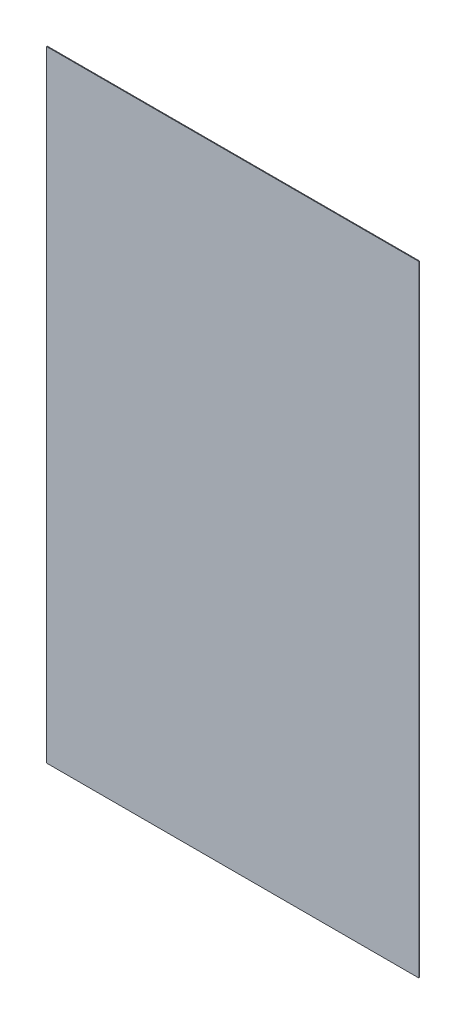
ISO-10303-21;
HEADER;
FILE_DESCRIPTION(('STEP AP214'),'2;1');
FILE_NAME('part.step','',(''),(''),'','','');
FILE_SCHEMA(('AUTOMOTIVE_DESIGN { 1 0 10303 214 1 1 1 1 }'));
ENDSEC;
DATA;
#1=APPLICATION_CONTEXT('core data for automotive mechanical design processes');
#2=APPLICATION_PROTOCOL_DEFINITION('international standard','automotive_design',2000,#1);
#3=PRODUCT_CONTEXT('',#1,'mechanical');
#4=PRODUCT('Part','Part','',(#3));
#5=PRODUCT_RELATED_PRODUCT_CATEGORY('part','',(#4));
#6=PRODUCT_DEFINITION_FORMATION('','',#4);
#7=PRODUCT_DEFINITION_CONTEXT('part definition',#1,'design');
#8=PRODUCT_DEFINITION('design','',#6,#7);
#9=PRODUCT_DEFINITION_SHAPE('','',#8);
#10=(LENGTH_UNIT() NAMED_UNIT(*) SI_UNIT(.MILLI.,.METRE.));
#11=(NAMED_UNIT(*) PLANE_ANGLE_UNIT() SI_UNIT($,.RADIAN.));
#12=(NAMED_UNIT(*) SI_UNIT($,.STERADIAN.) SOLID_ANGLE_UNIT());
#13=UNCERTAINTY_MEASURE_WITH_UNIT(LENGTH_MEASURE(1.E-05),#10,'distance_accuracy_value','');
#14=(GEOMETRIC_REPRESENTATION_CONTEXT(3) GLOBAL_UNCERTAINTY_ASSIGNED_CONTEXT((#13)) GLOBAL_UNIT_ASSIGNED_CONTEXT((#10,
#11,#12)) REPRESENTATION_CONTEXT('',''));
#15=CARTESIAN_POINT('',(0.,0.,0.));
#16=DIRECTION('',(0.,0.,1.));
#17=DIRECTION('',(1.,0.,0.));
#18=AXIS2_PLACEMENT_3D('',#15,#16,#17);
#19=CARTESIAN_POINT('',(0.,0.,3.));
#20=DIRECTION('',(1.,0.,0.));
#21=DIRECTION('',(0.,1.,0.));
#22=AXIS2_PLACEMENT_3D('',#19,#20,#21);
#23=PLANE('',#22);
#24=DIRECTION('',(0.,-1.,0.));
#25=VECTOR('',#24,1.);
#26=CARTESIAN_POINT('',(0.,0.,0.));
#27=LINE('',#26,#25);
#28=CARTESIAN_POINT('',(0.,0.,0.));
#29=VERTEX_POINT('',#28);
#30=CARTESIAN_POINT('',(3.06161699786838E-13,-2500.,0.));
#31=VERTEX_POINT('',#30);
#32=EDGE_CURVE('E98',#29,#31,#27,.T.);
#33=ORIENTED_EDGE('',*,*,#32,.T.);
#34=DIRECTION('',(0.,0.,-1.));
#35=VECTOR('',#34,1.);
#36=CARTESIAN_POINT('',(3.06161699786838E-13,-2500.,3.));
#37=LINE('',#36,#35);
#38=CARTESIAN_POINT('',(3.06161699786838E-13,-2500.,3.));
#39=VERTEX_POINT('',#38);
#40=EDGE_CURVE('E11',#39,#31,#37,.T.);
#41=ORIENTED_EDGE('',*,*,#40,.F.);
#42=DIRECTION('',(0.,-1.,0.));
#43=VECTOR('',#42,1.);
#44=CARTESIAN_POINT('',(0.,0.,3.));
#45=LINE('',#44,#43);
#46=CARTESIAN_POINT('',(0.,0.,3.));
#47=VERTEX_POINT('',#46);
#48=EDGE_CURVE('E86',#47,#39,#45,.T.);
#49=ORIENTED_EDGE('',*,*,#48,.F.);
#50=DIRECTION('',(0.,0.,-1.));
#51=VECTOR('',#50,1.);
#52=CARTESIAN_POINT('',(0.,0.,3.));
#53=LINE('',#52,#51);
#54=EDGE_CURVE('E94',#47,#29,#53,.T.);
#55=ORIENTED_EDGE('',*,*,#54,.T.);
#56=EDGE_LOOP('',(#33,#41,#49,#55));
#57=FACE_BOUND('',#56,.T.);
#58=ADVANCED_FACE('F35',(#57),#23,.F.);
#59=CARTESIAN_POINT('',(3.06161699786838E-13,-2500.,3.));
#60=DIRECTION('',(0.,1.,0.));
#61=DIRECTION('',(0.,0.,1.));
#62=AXIS2_PLACEMENT_3D('',#59,#60,#61);
#63=PLANE('',#62);
#64=DIRECTION('',(1.,0.,0.));
#65=VECTOR('',#64,1.);
#66=CARTESIAN_POINT('',(3.06161699786838E-13,-2500.,0.));
#67=LINE('',#66,#65);
#68=CARTESIAN_POINT('',(1500.,-2500.,0.));
#69=VERTEX_POINT('',#68);
#70=EDGE_CURVE('E90',#31,#69,#67,.T.);
#71=ORIENTED_EDGE('',*,*,#70,.T.);
#72=DIRECTION('',(0.,0.,-1.));
#73=VECTOR('',#72,1.);
#74=CARTESIAN_POINT('',(1500.,-2500.,3.));
#75=LINE('',#74,#73);
#76=CARTESIAN_POINT('',(1500.,-2500.,3.));
#77=VERTEX_POINT('',#76);
#78=EDGE_CURVE('E43',#77,#69,#75,.T.);
#79=ORIENTED_EDGE('',*,*,#78,.F.);
#80=DIRECTION('',(1.,0.,0.));
#81=VECTOR('',#80,1.);
#82=CARTESIAN_POINT('',(3.06161699786838E-13,-2500.,3.));
#83=LINE('',#82,#81);
#84=EDGE_CURVE('E81',#39,#77,#83,.T.);
#85=ORIENTED_EDGE('',*,*,#84,.F.);
#86=ORIENTED_EDGE('',*,*,#40,.T.);
#87=EDGE_LOOP('',(#71,#79,#85,#86));
#88=FACE_BOUND('',#87,.T.);
#89=ADVANCED_FACE('F89',(#88),#63,.F.);
#90=CARTESIAN_POINT('',(1500.,0.,3.));
#91=DIRECTION('',(-1.,0.,0.));
#92=DIRECTION('',(0.,-1.,0.));
#93=AXIS2_PLACEMENT_3D('',#90,#91,#92);
#94=PLANE('',#93);
#95=DIRECTION('',(0.,1.,0.));
#96=VECTOR('',#95,1.);
#97=CARTESIAN_POINT('',(1500.,0.,0.));
#98=LINE('',#97,#96);
#99=CARTESIAN_POINT('',(1500.,0.,0.));
#100=VERTEX_POINT('',#99);
#101=EDGE_CURVE('E68',#69,#100,#98,.T.);
#102=ORIENTED_EDGE('',*,*,#101,.T.);
#103=DIRECTION('',(0.,0.,-1.));
#104=VECTOR('',#103,1.);
#105=CARTESIAN_POINT('',(1500.,0.,3.));
#106=LINE('',#105,#104);
#107=CARTESIAN_POINT('',(1500.,0.,3.));
#108=VERTEX_POINT('',#107);
#109=EDGE_CURVE('E91',#108,#100,#106,.T.);
#110=ORIENTED_EDGE('',*,*,#109,.F.);
#111=DIRECTION('',(0.,1.,0.));
#112=VECTOR('',#111,1.);
#113=CARTESIAN_POINT('',(1500.,0.,3.));
#114=LINE('',#113,#112);
#115=EDGE_CURVE('E84',#77,#108,#114,.T.);
#116=ORIENTED_EDGE('',*,*,#115,.F.);
#117=ORIENTED_EDGE('',*,*,#78,.T.);
#118=EDGE_LOOP('',(#102,#110,#116,#117));
#119=FACE_BOUND('',#118,.T.);
#120=ADVANCED_FACE('F92',(#119),#94,.F.);
#121=CARTESIAN_POINT('',(0.,0.,3.));
#122=DIRECTION('',(0.,-1.,0.));
#123=DIRECTION('',(0.,0.,-1.));
#124=AXIS2_PLACEMENT_3D('',#121,#122,#123);
#125=PLANE('',#124);
#126=DIRECTION('',(-1.,0.,0.));
#127=VECTOR('',#126,1.);
#128=CARTESIAN_POINT('',(0.,0.,0.));
#129=LINE('',#128,#127);
#130=EDGE_CURVE('E74',#100,#29,#129,.T.);
#131=ORIENTED_EDGE('',*,*,#130,.T.);
#132=ORIENTED_EDGE('',*,*,#54,.F.);
#133=DIRECTION('',(-1.,0.,0.));
#134=VECTOR('',#133,1.);
#135=CARTESIAN_POINT('',(0.,0.,3.));
#136=LINE('',#135,#134);
#137=EDGE_CURVE('E51',#108,#47,#136,.T.);
#138=ORIENTED_EDGE('',*,*,#137,.F.);
#139=ORIENTED_EDGE('',*,*,#109,.T.);
#140=EDGE_LOOP('',(#131,#132,#138,#139));
#141=FACE_BOUND('',#140,.T.);
#142=ADVANCED_FACE('F105',(#141),#125,.F.);
#143=CARTESIAN_POINT('',(0.,0.,3.));
#144=DIRECTION('',(0.,0.,1.));
#145=DIRECTION('',(1.,0.,0.));
#146=AXIS2_PLACEMENT_3D('',#143,#144,#145);
#147=PLANE('',#146);
#148=ORIENTED_EDGE('',*,*,#48,.T.);
#149=ORIENTED_EDGE('',*,*,#84,.T.);
#150=ORIENTED_EDGE('',*,*,#115,.T.);
#151=ORIENTED_EDGE('',*,*,#137,.T.);
#152=EDGE_LOOP('',(#148,#149,#150,#151));
#153=FACE_BOUND('',#152,.T.);
#154=ADVANCED_FACE('F82',(#153),#147,.T.);
#155=CARTESIAN_POINT('',(0.,0.,0.));
#156=DIRECTION('',(0.,0.,1.));
#157=DIRECTION('',(1.,0.,0.));
#158=AXIS2_PLACEMENT_3D('',#155,#156,#157);
#159=PLANE('',#158);
#160=ORIENTED_EDGE('',*,*,#32,.F.);
#161=ORIENTED_EDGE('',*,*,#130,.F.);
#162=ORIENTED_EDGE('',*,*,#101,.F.);
#163=ORIENTED_EDGE('',*,*,#70,.F.);
#164=EDGE_LOOP('',(#160,#161,#162,#163));
#165=FACE_BOUND('',#164,.T.);
#166=ADVANCED_FACE('F108',(#165),#159,.F.);
#167=CLOSED_SHELL('',(#58,#89,#120,#142,#154,#166));
#168=MANIFOLD_SOLID_BREP('B2',#167);
#169=ADVANCED_BREP_SHAPE_REPRESENTATION('',(#18,#168),#14);
#170=SHAPE_DEFINITION_REPRESENTATION(#9,#169);
ENDSEC;
END-ISO-10303-21;
